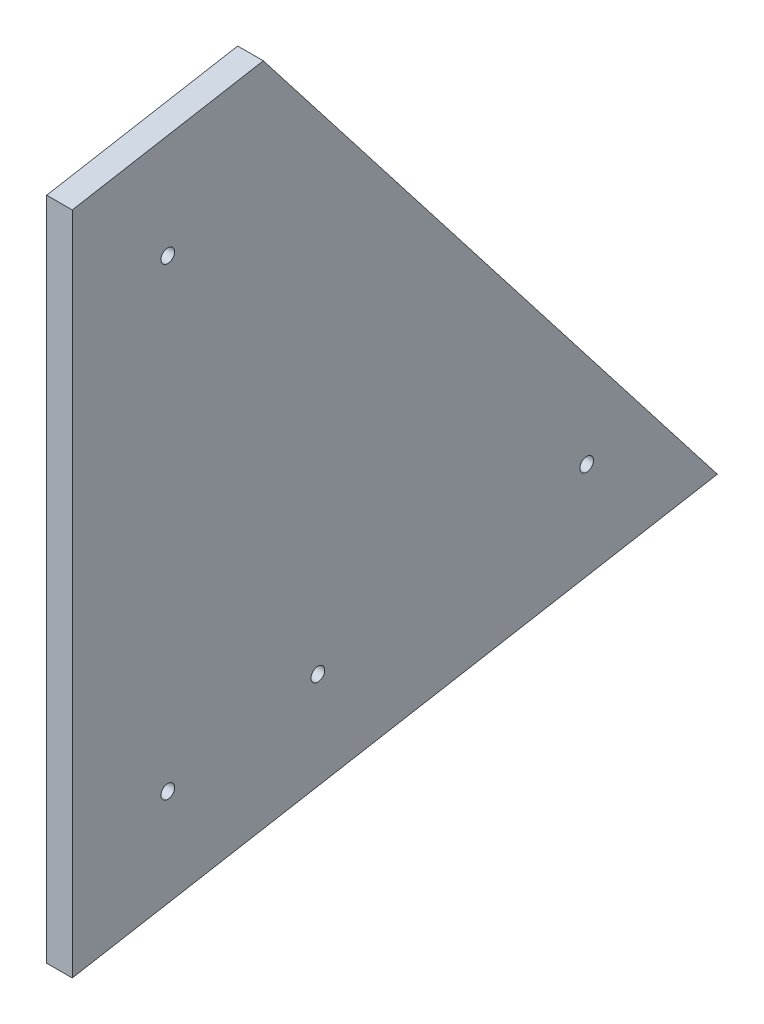
ISO-10303-21;
HEADER;
FILE_DESCRIPTION(('STEP AP214'),'2;1');
FILE_NAME('part.step','',(''),(''),'','','');
FILE_SCHEMA(('AUTOMOTIVE_DESIGN { 1 0 10303 214 1 1 1 1 }'));
ENDSEC;
DATA;
#1=APPLICATION_CONTEXT('core data for automotive mechanical design processes');
#2=APPLICATION_PROTOCOL_DEFINITION('international standard','automotive_design',2000,#1);
#3=PRODUCT_CONTEXT('',#1,'mechanical');
#4=PRODUCT('Part','Part','',(#3));
#5=PRODUCT_RELATED_PRODUCT_CATEGORY('part','',(#4));
#6=PRODUCT_DEFINITION_FORMATION('','',#4);
#7=PRODUCT_DEFINITION_CONTEXT('part definition',#1,'design');
#8=PRODUCT_DEFINITION('design','',#6,#7);
#9=PRODUCT_DEFINITION_SHAPE('','',#8);
#10=(LENGTH_UNIT() NAMED_UNIT(*) SI_UNIT(.MILLI.,.METRE.));
#11=(NAMED_UNIT(*) PLANE_ANGLE_UNIT() SI_UNIT($,.RADIAN.));
#12=(NAMED_UNIT(*) SI_UNIT($,.STERADIAN.) SOLID_ANGLE_UNIT());
#13=UNCERTAINTY_MEASURE_WITH_UNIT(LENGTH_MEASURE(1.E-05),#10,'distance_accuracy_value','');
#14=(GEOMETRIC_REPRESENTATION_CONTEXT(3) GLOBAL_UNCERTAINTY_ASSIGNED_CONTEXT((#13)) GLOBAL_UNIT_ASSIGNED_CONTEXT((#10,
#11,#12)) REPRESENTATION_CONTEXT('',''));
#15=CARTESIAN_POINT('',(0.,0.,0.));
#16=DIRECTION('',(0.,0.,1.));
#17=DIRECTION('',(1.,0.,0.));
#18=AXIS2_PLACEMENT_3D('',#15,#16,#17);
#19=CARTESIAN_POINT('',(11.90625,0.,0.));
#20=DIRECTION('',(0.,0.984807753012208,0.173648177666927));
#21=DIRECTION('',(0.,-0.173648177666927,0.984807753012209));
#22=AXIS2_PLACEMENT_3D('',#19,#20,#21);
#23=PLANE('',#22);
#24=DIRECTION('',(0.,0.173648177666927,-0.984807753012209));
#25=VECTOR('',#24,1.);
#26=CARTESIAN_POINT('',(0.,0.,0.));
#27=LINE('',#26,#25);
#28=CARTESIAN_POINT('',(0.,0.,0.));
#29=VERTEX_POINT('',#28);
#30=CARTESIAN_POINT('',(0.,52.9279645528795,-300.169403118121));
#31=VERTEX_POINT('',#30);
#32=EDGE_CURVE('E95',#29,#31,#27,.T.);
#33=ORIENTED_EDGE('',*,*,#32,.T.);
#34=DIRECTION('',(-1.,0.,0.));
#35=VECTOR('',#34,1.);
#36=CARTESIAN_POINT('',(11.90625,52.9279645528795,-300.169403118121));
#37=LINE('',#36,#35);
#38=CARTESIAN_POINT('',(11.90625,52.9279645528795,-300.169403118121));
#39=VERTEX_POINT('',#38);
#40=EDGE_CURVE('E11',#39,#31,#37,.T.);
#41=ORIENTED_EDGE('',*,*,#40,.F.);
#42=DIRECTION('',(0.,0.173648177666927,-0.984807753012209));
#43=VECTOR('',#42,1.);
#44=CARTESIAN_POINT('',(11.90625,0.,0.));
#45=LINE('',#44,#43);
#46=CARTESIAN_POINT('',(11.90625,0.,0.));
#47=VERTEX_POINT('',#46);
#48=EDGE_CURVE('E83',#47,#39,#45,.T.);
#49=ORIENTED_EDGE('',*,*,#48,.F.);
#50=DIRECTION('',(-1.,0.,0.));
#51=VECTOR('',#50,1.);
#52=CARTESIAN_POINT('',(11.90625,0.,0.));
#53=LINE('',#52,#51);
#54=EDGE_CURVE('E91',#47,#29,#53,.T.);
#55=ORIENTED_EDGE('',*,*,#54,.T.);
#56=EDGE_LOOP('',(#33,#41,#49,#55));
#57=FACE_BOUND('',#56,.T.);
#58=ADVANCED_FACE('F32',(#57),#23,.F.);
#59=CARTESIAN_POINT('',(11.90625,325.177499887757,-88.9));
#60=DIRECTION('',(0.,-0.613071940192332,0.790027085705806));
#61=DIRECTION('',(0.,-0.790027085705806,-0.613071940192332));
#62=AXIS2_PLACEMENT_3D('',#59,#60,#61);
#63=PLANE('',#62);
#64=DIRECTION('',(0.,0.790027085705806,0.613071940192332));
#65=VECTOR('',#64,1.);
#66=CARTESIAN_POINT('',(0.,325.177499887757,-88.9));
#67=LINE('',#66,#65);
#68=CARTESIAN_POINT('',(0.,325.177499887757,-88.9));
#69=VERTEX_POINT('',#68);
#70=EDGE_CURVE('E87',#31,#69,#67,.T.);
#71=ORIENTED_EDGE('',*,*,#70,.T.);
#72=DIRECTION('',(-1.,0.,0.));
#73=VECTOR('',#72,1.);
#74=CARTESIAN_POINT('',(11.90625,325.177499887757,-88.9));
#75=LINE('',#74,#73);
#76=CARTESIAN_POINT('',(11.90625,325.177499887757,-88.9));
#77=VERTEX_POINT('',#76);
#78=EDGE_CURVE('E40',#77,#69,#75,.T.);
#79=ORIENTED_EDGE('',*,*,#78,.F.);
#80=DIRECTION('',(0.,0.790027085705806,0.613071940192332));
#81=VECTOR('',#80,1.);
#82=CARTESIAN_POINT('',(11.90625,325.177499887757,-88.9));
#83=LINE('',#82,#81);
#84=EDGE_CURVE('E78',#39,#77,#83,.T.);
#85=ORIENTED_EDGE('',*,*,#84,.F.);
#86=ORIENTED_EDGE('',*,*,#40,.T.);
#87=EDGE_LOOP('',(#71,#79,#85,#86));
#88=FACE_BOUND('',#87,.T.);
#89=ADVANCED_FACE('F86',(#88),#63,.F.);
#90=CARTESIAN_POINT('',(11.90625,309.502031302775,0.));
#91=DIRECTION('',(0.,-0.984807753012209,-0.173648177666928));
#92=DIRECTION('',(0.,0.173648177666928,-0.984807753012209));
#93=AXIS2_PLACEMENT_3D('',#90,#91,#92);
#94=PLANE('',#93);
#95=DIRECTION('',(0.,-0.173648177666928,0.984807753012208));
#96=VECTOR('',#95,1.);
#97=CARTESIAN_POINT('',(0.,309.502031302775,0.));
#98=LINE('',#97,#96);
#99=CARTESIAN_POINT('',(0.,309.502031302775,0.));
#100=VERTEX_POINT('',#99);
#101=EDGE_CURVE('E65',#69,#100,#98,.T.);
#102=ORIENTED_EDGE('',*,*,#101,.T.);
#103=DIRECTION('',(-1.,0.,0.));
#104=VECTOR('',#103,1.);
#105=CARTESIAN_POINT('',(11.90625,309.502031302775,0.));
#106=LINE('',#105,#104);
#107=CARTESIAN_POINT('',(11.90625,309.502031302775,0.));
#108=VERTEX_POINT('',#107);
#109=EDGE_CURVE('E88',#108,#100,#106,.T.);
#110=ORIENTED_EDGE('',*,*,#109,.F.);
#111=DIRECTION('',(0.,-0.173648177666928,0.984807753012208));
#112=VECTOR('',#111,1.);
#113=CARTESIAN_POINT('',(11.90625,309.502031302775,0.));
#114=LINE('',#113,#112);
#115=EDGE_CURVE('E81',#77,#108,#114,.T.);
#116=ORIENTED_EDGE('',*,*,#115,.F.);
#117=ORIENTED_EDGE('',*,*,#78,.T.);
#118=EDGE_LOOP('',(#102,#110,#116,#117));
#119=FACE_BOUND('',#118,.T.);
#120=ADVANCED_FACE('F89',(#119),#94,.F.);
#121=CARTESIAN_POINT('',(11.90625,0.,0.));
#122=DIRECTION('',(0.,0.,-1.));
#123=DIRECTION('',(-1.,0.,0.));
#124=AXIS2_PLACEMENT_3D('',#121,#122,#123);
#125=PLANE('',#124);
#126=DIRECTION('',(0.,-1.,0.));
#127=VECTOR('',#126,1.);
#128=CARTESIAN_POINT('',(0.,0.,0.));
#129=LINE('',#128,#127);
#130=EDGE_CURVE('E71',#100,#29,#129,.T.);
#131=ORIENTED_EDGE('',*,*,#130,.T.);
#132=ORIENTED_EDGE('',*,*,#54,.F.);
#133=DIRECTION('',(0.,-1.,0.));
#134=VECTOR('',#133,1.);
#135=CARTESIAN_POINT('',(11.90625,0.,0.));
#136=LINE('',#135,#134);
#137=EDGE_CURVE('E48',#108,#47,#136,.T.);
#138=ORIENTED_EDGE('',*,*,#137,.F.);
#139=ORIENTED_EDGE('',*,*,#109,.T.);
#140=EDGE_LOOP('',(#131,#132,#138,#139));
#141=FACE_BOUND('',#140,.T.);
#142=ADVANCED_FACE('F103',(#141),#125,.F.);
#143=CARTESIAN_POINT('',(11.90625,0.,0.));
#144=DIRECTION('',(1.,0.,0.));
#145=DIRECTION('',(0.,0.,-1.));
#146=AXIS2_PLACEMENT_3D('',#143,#144,#145);
#147=PLANE('',#146);
#148=CARTESIAN_POINT('',(11.90625,52.9734471908125,-44.45));
#149=DIRECTION('',(1.,0.,0.));
#150=DIRECTION('',(0.,0.,-1.));
#151=AXIS2_PLACEMENT_3D('',#148,#149,#150);
#152=CIRCLE('',#151,3.17499999999998);
#153=CARTESIAN_POINT('',(11.90625,52.9734471908125,-47.625));
#154=VERTEX_POINT('',#153);
#155=EDGE_CURVE('E129',#154,#154,#152,.T.);
#156=ORIENTED_EDGE('',*,*,#155,.F.);
#157=EDGE_LOOP('',(#156));
#158=FACE_BOUND('',#157,.T.);
#159=CARTESIAN_POINT('',(11.90625,65.2898867932985,-114.3));
#160=DIRECTION('',(1.,0.,0.));
#161=DIRECTION('',(0.,0.,-1.));
#162=AXIS2_PLACEMENT_3D('',#159,#160,#161);
#163=CIRCLE('',#162,3.17499999999998);
#164=CARTESIAN_POINT('',(11.90625,65.2898867932985,-117.475));
#165=VERTEX_POINT('',#164);
#166=EDGE_CURVE('E123',#165,#165,#163,.T.);
#167=ORIENTED_EDGE('',*,*,#166,.F.);
#168=EDGE_LOOP('',(#167));
#169=FACE_BOUND('',#168,.T.);
#170=CARTESIAN_POINT('',(11.90625,87.3432053569983,-239.370584632551));
#171=DIRECTION('',(1.,0.,0.));
#172=DIRECTION('',(0.,0.,-1.));
#173=AXIS2_PLACEMENT_3D('',#170,#171,#172);
#174=CIRCLE('',#173,3.17499999999998);
#175=CARTESIAN_POINT('',(11.90625,87.3432053569983,-242.54558463255));
#176=VERTEX_POINT('',#175);
#177=EDGE_CURVE('E117',#176,#176,#174,.T.);
#178=ORIENTED_EDGE('',*,*,#177,.F.);
#179=EDGE_LOOP('',(#178));
#180=FACE_BOUND('',#179,.T.);
#181=CARTESIAN_POINT('',(11.90625,268.873447190812,-44.45));
#182=DIRECTION('',(1.,0.,0.));
#183=DIRECTION('',(0.,0.,-1.));
#184=AXIS2_PLACEMENT_3D('',#181,#182,#183);
#185=CIRCLE('',#184,3.17499999999998);
#186=CARTESIAN_POINT('',(11.90625,268.873447190812,-47.625));
#187=VERTEX_POINT('',#186);
#188=EDGE_CURVE('E111',#187,#187,#185,.T.);
#189=ORIENTED_EDGE('',*,*,#188,.F.);
#190=EDGE_LOOP('',(#189));
#191=FACE_BOUND('',#190,.T.);
#192=ORIENTED_EDGE('',*,*,#48,.T.);
#193=ORIENTED_EDGE('',*,*,#84,.T.);
#194=ORIENTED_EDGE('',*,*,#115,.T.);
#195=ORIENTED_EDGE('',*,*,#137,.T.);
#196=EDGE_LOOP('',(#192,#193,#194,#195));
#197=FACE_BOUND('',#196,.T.);
#198=ADVANCED_FACE('F79',(#158,#169,#180,#191,#197),#147,.T.);
#199=CARTESIAN_POINT('',(0.,0.,0.));
#200=DIRECTION('',(1.,0.,0.));
#201=DIRECTION('',(0.,0.,-1.));
#202=AXIS2_PLACEMENT_3D('',#199,#200,#201);
#203=PLANE('',#202);
#204=CARTESIAN_POINT('',(0.,52.9734471908125,-44.45));
#205=DIRECTION('',(1.,0.,0.));
#206=DIRECTION('',(0.,0.,-1.));
#207=AXIS2_PLACEMENT_3D('',#204,#205,#206);
#208=CIRCLE('',#207,3.175);
#209=CARTESIAN_POINT('',(0.,52.9734471908125,-47.625));
#210=VERTEX_POINT('',#209);
#211=EDGE_CURVE('E126',#210,#210,#208,.T.);
#212=ORIENTED_EDGE('',*,*,#211,.T.);
#213=EDGE_LOOP('',(#212));
#214=FACE_BOUND('',#213,.T.);
#215=CARTESIAN_POINT('',(0.,65.2898867932985,-114.3));
#216=DIRECTION('',(1.,0.,0.));
#217=DIRECTION('',(0.,0.,-1.));
#218=AXIS2_PLACEMENT_3D('',#215,#216,#217);
#219=CIRCLE('',#218,3.175);
#220=CARTESIAN_POINT('',(0.,65.2898867932985,-117.475));
#221=VERTEX_POINT('',#220);
#222=EDGE_CURVE('E120',#221,#221,#219,.T.);
#223=ORIENTED_EDGE('',*,*,#222,.T.);
#224=EDGE_LOOP('',(#223));
#225=FACE_BOUND('',#224,.T.);
#226=CARTESIAN_POINT('',(0.,87.3432053569983,-239.370584632551));
#227=DIRECTION('',(1.,0.,0.));
#228=DIRECTION('',(0.,0.,-1.));
#229=AXIS2_PLACEMENT_3D('',#226,#227,#228);
#230=CIRCLE('',#229,3.175);
#231=CARTESIAN_POINT('',(0.,87.3432053569983,-242.54558463255));
#232=VERTEX_POINT('',#231);
#233=EDGE_CURVE('E114',#232,#232,#230,.T.);
#234=ORIENTED_EDGE('',*,*,#233,.T.);
#235=EDGE_LOOP('',(#234));
#236=FACE_BOUND('',#235,.T.);
#237=CARTESIAN_POINT('',(0.,268.873447190812,-44.45));
#238=DIRECTION('',(1.,0.,0.));
#239=DIRECTION('',(0.,0.,-1.));
#240=AXIS2_PLACEMENT_3D('',#237,#238,#239);
#241=CIRCLE('',#240,3.17499999999998);
#242=CARTESIAN_POINT('',(0.,268.873447190812,-47.625));
#243=VERTEX_POINT('',#242);
#244=EDGE_CURVE('E98',#243,#243,#241,.T.);
#245=ORIENTED_EDGE('',*,*,#244,.T.);
#246=EDGE_LOOP('',(#245));
#247=FACE_BOUND('',#246,.T.);
#248=ORIENTED_EDGE('',*,*,#32,.F.);
#249=ORIENTED_EDGE('',*,*,#130,.F.);
#250=ORIENTED_EDGE('',*,*,#101,.F.);
#251=ORIENTED_EDGE('',*,*,#70,.F.);
#252=EDGE_LOOP('',(#248,#249,#250,#251));
#253=FACE_BOUND('',#252,.T.);
#254=ADVANCED_FACE('F106',(#214,#225,#236,#247,#253),#203,.F.);
#255=CARTESIAN_POINT('',(11.90625,268.873447190812,-44.45));
#256=DIRECTION('',(1.,0.,0.));
#257=DIRECTION('',(0.,0.,-1.));
#258=AXIS2_PLACEMENT_3D('',#255,#256,#257);
#259=CYLINDRICAL_SURFACE('',#258,3.17499999999998);
#260=ORIENTED_EDGE('',*,*,#244,.F.);
#261=EDGE_LOOP('',(#260));
#262=FACE_BOUND('',#261,.T.);
#263=ORIENTED_EDGE('',*,*,#188,.T.);
#264=EDGE_LOOP('',(#263));
#265=FACE_BOUND('',#264,.T.);
#266=ADVANCED_FACE('F144',(#262,#265),#259,.F.);
#267=CARTESIAN_POINT('',(11.90625,87.3432053569983,-239.370584632551));
#268=DIRECTION('',(1.,0.,0.));
#269=DIRECTION('',(0.,0.,-1.));
#270=AXIS2_PLACEMENT_3D('',#267,#268,#269);
#271=CYLINDRICAL_SURFACE('',#270,3.17499999999999);
#272=ORIENTED_EDGE('',*,*,#233,.F.);
#273=EDGE_LOOP('',(#272));
#274=FACE_BOUND('',#273,.T.);
#275=ORIENTED_EDGE('',*,*,#177,.T.);
#276=EDGE_LOOP('',(#275));
#277=FACE_BOUND('',#276,.T.);
#278=ADVANCED_FACE('F146',(#274,#277),#271,.F.);
#279=CARTESIAN_POINT('',(11.90625,65.2898867932985,-114.3));
#280=DIRECTION('',(1.,0.,0.));
#281=DIRECTION('',(0.,0.,-1.));
#282=AXIS2_PLACEMENT_3D('',#279,#280,#281);
#283=CYLINDRICAL_SURFACE('',#282,3.17499999999999);
#284=ORIENTED_EDGE('',*,*,#222,.F.);
#285=EDGE_LOOP('',(#284));
#286=FACE_BOUND('',#285,.T.);
#287=ORIENTED_EDGE('',*,*,#166,.T.);
#288=EDGE_LOOP('',(#287));
#289=FACE_BOUND('',#288,.T.);
#290=ADVANCED_FACE('F153',(#286,#289),#283,.F.);
#291=CARTESIAN_POINT('',(11.90625,52.9734471908125,-44.45));
#292=DIRECTION('',(1.,0.,0.));
#293=DIRECTION('',(0.,0.,-1.));
#294=AXIS2_PLACEMENT_3D('',#291,#292,#293);
#295=CYLINDRICAL_SURFACE('',#294,3.17499999999999);
#296=ORIENTED_EDGE('',*,*,#211,.F.);
#297=EDGE_LOOP('',(#296));
#298=FACE_BOUND('',#297,.T.);
#299=ORIENTED_EDGE('',*,*,#155,.T.);
#300=EDGE_LOOP('',(#299));
#301=FACE_BOUND('',#300,.T.);
#302=ADVANCED_FACE('F133',(#298,#301),#295,.F.);
#303=CLOSED_SHELL('',(#58,#89,#120,#142,#198,#254,#266,#278,#290,#302));
#304=MANIFOLD_SOLID_BREP('B2',#303);
#305=ADVANCED_BREP_SHAPE_REPRESENTATION('',(#18,#304),#14);
#306=SHAPE_DEFINITION_REPRESENTATION(#9,#305);
ENDSEC;
END-ISO-10303-21;
